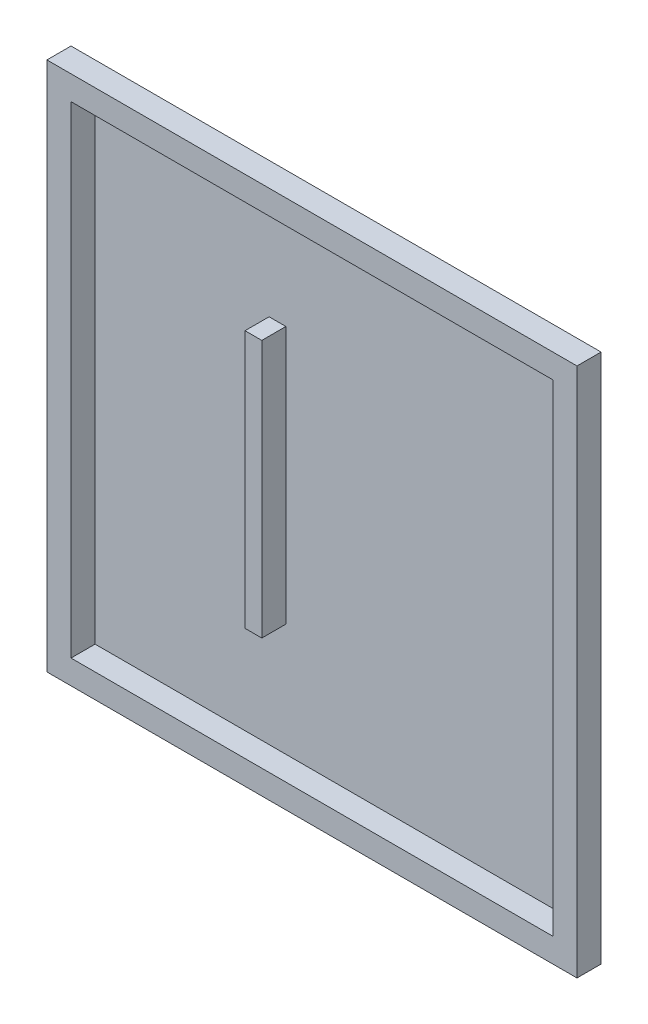
ISO-10303-21;
HEADER;
FILE_DESCRIPTION(('STEP AP214'),'2;1');
FILE_NAME('part.step','',(''),(''),'','','');
FILE_SCHEMA(('AUTOMOTIVE_DESIGN { 1 0 10303 214 1 1 1 1 }'));
ENDSEC;
DATA;
#1=APPLICATION_CONTEXT('core data for automotive mechanical design processes');
#2=APPLICATION_PROTOCOL_DEFINITION('international standard','automotive_design',2000,#1);
#3=PRODUCT_CONTEXT('',#1,'mechanical');
#4=PRODUCT('Part','Part','',(#3));
#5=PRODUCT_RELATED_PRODUCT_CATEGORY('part','',(#4));
#6=PRODUCT_DEFINITION_FORMATION('','',#4);
#7=PRODUCT_DEFINITION_CONTEXT('part definition',#1,'design');
#8=PRODUCT_DEFINITION('design','',#6,#7);
#9=PRODUCT_DEFINITION_SHAPE('','',#8);
#10=(LENGTH_UNIT() NAMED_UNIT(*) SI_UNIT(.MILLI.,.METRE.));
#11=(NAMED_UNIT(*) PLANE_ANGLE_UNIT() SI_UNIT($,.RADIAN.));
#12=(NAMED_UNIT(*) SI_UNIT($,.STERADIAN.) SOLID_ANGLE_UNIT());
#13=UNCERTAINTY_MEASURE_WITH_UNIT(LENGTH_MEASURE(1.E-05),#10,'distance_accuracy_value','');
#14=(GEOMETRIC_REPRESENTATION_CONTEXT(3) GLOBAL_UNCERTAINTY_ASSIGNED_CONTEXT((#13)) GLOBAL_UNIT_ASSIGNED_CONTEXT((#10,
#11,#12)) REPRESENTATION_CONTEXT('',''));
#15=CARTESIAN_POINT('',(0.,0.,0.));
#16=DIRECTION('',(0.,0.,1.));
#17=DIRECTION('',(1.,0.,0.));
#18=AXIS2_PLACEMENT_3D('',#15,#16,#17);
#19=CARTESIAN_POINT('',(0.,0.,1.1));
#20=DIRECTION('',(0.,0.,-1.));
#21=DIRECTION('',(-1.,0.,0.));
#22=AXIS2_PLACEMENT_3D('',#19,#20,#21);
#23=PLANE('',#22);
#24=DIRECTION('',(0.,-1.,0.));
#25=VECTOR('',#24,1.);
#26=CARTESIAN_POINT('',(-22.,0.,1.1));
#27=LINE('',#26,#25);
#28=CARTESIAN_POINT('',(-22.,22.,1.1));
#29=VERTEX_POINT('',#28);
#30=CARTESIAN_POINT('',(-22.,0.,1.1));
#31=VERTEX_POINT('',#30);
#32=EDGE_CURVE('E144',#29,#31,#27,.T.);
#33=ORIENTED_EDGE('',*,*,#32,.T.);
#34=DIRECTION('',(1.,0.,0.));
#35=VECTOR('',#34,1.);
#36=CARTESIAN_POINT('',(-22.,0.,1.1));
#37=LINE('',#36,#35);
#38=CARTESIAN_POINT('',(0.,0.,1.1));
#39=VERTEX_POINT('',#38);
#40=EDGE_CURVE('E147',#31,#39,#37,.T.);
#41=ORIENTED_EDGE('',*,*,#40,.T.);
#42=DIRECTION('',(0.,1.,0.));
#43=VECTOR('',#42,1.);
#44=CARTESIAN_POINT('',(0.,0.,1.1));
#45=LINE('',#44,#43);
#46=CARTESIAN_POINT('',(0.,22.,1.1));
#47=VERTEX_POINT('',#46);
#48=EDGE_CURVE('E150',#39,#47,#45,.T.);
#49=ORIENTED_EDGE('',*,*,#48,.T.);
#50=DIRECTION('',(-1.,0.,0.));
#51=VECTOR('',#50,1.);
#52=CARTESIAN_POINT('',(-22.,22.,1.1));
#53=LINE('',#52,#51);
#54=EDGE_CURVE('E152',#47,#29,#53,.T.);
#55=ORIENTED_EDGE('',*,*,#54,.T.);
#56=EDGE_LOOP('',(#33,#41,#49,#55));
#57=FACE_BOUND('',#56,.T.);
#58=DIRECTION('',(-1.,0.,0.));
#59=VECTOR('',#58,1.);
#60=CARTESIAN_POINT('',(-1.,21.,1.1));
#61=LINE('',#60,#59);
#62=CARTESIAN_POINT('',(-1.,21.,1.1));
#63=VERTEX_POINT('',#62);
#64=CARTESIAN_POINT('',(-21.,21.,1.1));
#65=VERTEX_POINT('',#64);
#66=EDGE_CURVE('E108',#63,#65,#61,.T.);
#67=ORIENTED_EDGE('',*,*,#66,.F.);
#68=DIRECTION('',(0.,1.,0.));
#69=VECTOR('',#68,1.);
#70=CARTESIAN_POINT('',(-0.999999999999997,1.,1.1));
#71=LINE('',#70,#69);
#72=CARTESIAN_POINT('',(-0.999999999999997,1.,1.1));
#73=VERTEX_POINT('',#72);
#74=EDGE_CURVE('E130',#73,#63,#71,.T.);
#75=ORIENTED_EDGE('',*,*,#74,.F.);
#76=DIRECTION('',(1.,0.,0.));
#77=VECTOR('',#76,1.);
#78=CARTESIAN_POINT('',(-21.,1.,1.1));
#79=LINE('',#78,#77);
#80=CARTESIAN_POINT('',(-21.,1.,1.1));
#81=VERTEX_POINT('',#80);
#82=EDGE_CURVE('E128',#81,#73,#79,.T.);
#83=ORIENTED_EDGE('',*,*,#82,.F.);
#84=DIRECTION('',(0.,-1.,0.));
#85=VECTOR('',#84,1.);
#86=CARTESIAN_POINT('',(-21.,21.,1.1));
#87=LINE('',#86,#85);
#88=EDGE_CURVE('E116',#65,#81,#87,.T.);
#89=ORIENTED_EDGE('',*,*,#88,.F.);
#90=EDGE_LOOP('',(#67,#75,#83,#89));
#91=FACE_BOUND('',#90,.T.);
#92=ADVANCED_FACE('F43',(#57,#91),#23,.F.);
#93=CARTESIAN_POINT('',(0.,0.,0.1));
#94=DIRECTION('',(0.,0.,-1.));
#95=DIRECTION('',(-1.,0.,0.));
#96=AXIS2_PLACEMENT_3D('',#93,#94,#95);
#97=PLANE('',#96);
#98=DIRECTION('',(0.,-1.,0.));
#99=VECTOR('',#98,1.);
#100=CARTESIAN_POINT('',(-22.,0.,0.1));
#101=LINE('',#100,#99);
#102=CARTESIAN_POINT('',(-22.,22.,0.1));
#103=VERTEX_POINT('',#102);
#104=CARTESIAN_POINT('',(-22.,0.,0.1));
#105=VERTEX_POINT('',#104);
#106=EDGE_CURVE('E124',#103,#105,#101,.T.);
#107=ORIENTED_EDGE('',*,*,#106,.F.);
#108=DIRECTION('',(-1.,0.,0.));
#109=VECTOR('',#108,1.);
#110=CARTESIAN_POINT('',(-22.,22.,0.1));
#111=LINE('',#110,#109);
#112=CARTESIAN_POINT('',(0.,22.,0.1));
#113=VERTEX_POINT('',#112);
#114=EDGE_CURVE('E148',#113,#103,#111,.T.);
#115=ORIENTED_EDGE('',*,*,#114,.F.);
#116=DIRECTION('',(0.,1.,0.));
#117=VECTOR('',#116,1.);
#118=CARTESIAN_POINT('',(0.,0.,0.1));
#119=LINE('',#118,#117);
#120=CARTESIAN_POINT('',(0.,0.,0.1));
#121=VERTEX_POINT('',#120);
#122=EDGE_CURVE('E159',#121,#113,#119,.T.);
#123=ORIENTED_EDGE('',*,*,#122,.F.);
#124=DIRECTION('',(1.,0.,0.));
#125=VECTOR('',#124,1.);
#126=CARTESIAN_POINT('',(-22.,0.,0.1));
#127=LINE('',#126,#125);
#128=EDGE_CURVE('E157',#105,#121,#127,.T.);
#129=ORIENTED_EDGE('',*,*,#128,.F.);
#130=EDGE_LOOP('',(#107,#115,#123,#129));
#131=FACE_BOUND('',#130,.T.);
#132=DIRECTION('',(0.,1.,0.));
#133=VECTOR('',#132,1.);
#134=CARTESIAN_POINT('',(-0.999999999999997,1.,0.1));
#135=LINE('',#134,#133);
#136=CARTESIAN_POINT('',(-0.999999999999997,1.,0.1));
#137=VERTEX_POINT('',#136);
#138=CARTESIAN_POINT('',(-1.,21.,0.1));
#139=VERTEX_POINT('',#138);
#140=EDGE_CURVE('E117',#137,#139,#135,.T.);
#141=ORIENTED_EDGE('',*,*,#140,.T.);
#142=DIRECTION('',(-1.,0.,0.));
#143=VECTOR('',#142,1.);
#144=CARTESIAN_POINT('',(-1.,21.,0.1));
#145=LINE('',#144,#143);
#146=CARTESIAN_POINT('',(-21.,21.,0.1));
#147=VERTEX_POINT('',#146);
#148=EDGE_CURVE('E66',#139,#147,#145,.T.);
#149=ORIENTED_EDGE('',*,*,#148,.T.);
#150=DIRECTION('',(0.,-1.,0.));
#151=VECTOR('',#150,1.);
#152=CARTESIAN_POINT('',(-21.,21.,0.1));
#153=LINE('',#152,#151);
#154=CARTESIAN_POINT('',(-21.,1.,0.1));
#155=VERTEX_POINT('',#154);
#156=EDGE_CURVE('E123',#147,#155,#153,.T.);
#157=ORIENTED_EDGE('',*,*,#156,.T.);
#158=DIRECTION('',(1.,0.,0.));
#159=VECTOR('',#158,1.);
#160=CARTESIAN_POINT('',(-21.,1.,0.1));
#161=LINE('',#160,#159);
#162=EDGE_CURVE('E136',#155,#137,#161,.T.);
#163=ORIENTED_EDGE('',*,*,#162,.T.);
#164=EDGE_LOOP('',(#141,#149,#157,#163));
#165=FACE_BOUND('',#164,.T.);
#166=ADVANCED_FACE('F177',(#131,#165),#97,.T.);
#167=CARTESIAN_POINT('',(-22.,0.,1.1));
#168=DIRECTION('',(1.,0.,0.));
#169=DIRECTION('',(0.,0.,-1.));
#170=AXIS2_PLACEMENT_3D('',#167,#168,#169);
#171=PLANE('',#170);
#172=ORIENTED_EDGE('',*,*,#106,.T.);
#173=DIRECTION('',(0.,0.,-1.));
#174=VECTOR('',#173,1.);
#175=CARTESIAN_POINT('',(-22.,0.,1.1));
#176=LINE('',#175,#174);
#177=EDGE_CURVE('E12',#31,#105,#176,.T.);
#178=ORIENTED_EDGE('',*,*,#177,.F.);
#179=ORIENTED_EDGE('',*,*,#32,.F.);
#180=DIRECTION('',(0.,0.,-1.));
#181=VECTOR('',#180,1.);
#182=CARTESIAN_POINT('',(-22.,22.,1.1));
#183=LINE('',#182,#181);
#184=EDGE_CURVE('E154',#29,#103,#183,.T.);
#185=ORIENTED_EDGE('',*,*,#184,.T.);
#186=EDGE_LOOP('',(#172,#178,#179,#185));
#187=FACE_BOUND('',#186,.T.);
#188=ADVANCED_FACE('F45',(#187),#171,.F.);
#189=CARTESIAN_POINT('',(-22.,0.,1.1));
#190=DIRECTION('',(0.,1.,0.));
#191=DIRECTION('',(0.,0.,1.));
#192=AXIS2_PLACEMENT_3D('',#189,#190,#191);
#193=PLANE('',#192);
#194=ORIENTED_EDGE('',*,*,#128,.T.);
#195=DIRECTION('',(0.,0.,-1.));
#196=VECTOR('',#195,1.);
#197=CARTESIAN_POINT('',(0.,0.,1.1));
#198=LINE('',#197,#196);
#199=EDGE_CURVE('E51',#39,#121,#198,.T.);
#200=ORIENTED_EDGE('',*,*,#199,.F.);
#201=ORIENTED_EDGE('',*,*,#40,.F.);
#202=ORIENTED_EDGE('',*,*,#177,.T.);
#203=EDGE_LOOP('',(#194,#200,#201,#202));
#204=FACE_BOUND('',#203,.T.);
#205=ADVANCED_FACE('F187',(#204),#193,.F.);
#206=CARTESIAN_POINT('',(0.,0.,1.1));
#207=DIRECTION('',(-1.,0.,0.));
#208=DIRECTION('',(0.,0.,1.));
#209=AXIS2_PLACEMENT_3D('',#206,#207,#208);
#210=PLANE('',#209);
#211=ORIENTED_EDGE('',*,*,#122,.T.);
#212=DIRECTION('',(0.,0.,-1.));
#213=VECTOR('',#212,1.);
#214=CARTESIAN_POINT('',(0.,22.,1.1));
#215=LINE('',#214,#213);
#216=EDGE_CURVE('E164',#47,#113,#215,.T.);
#217=ORIENTED_EDGE('',*,*,#216,.F.);
#218=ORIENTED_EDGE('',*,*,#48,.F.);
#219=ORIENTED_EDGE('',*,*,#199,.T.);
#220=EDGE_LOOP('',(#211,#217,#218,#219));
#221=FACE_BOUND('',#220,.T.);
#222=ADVANCED_FACE('F171',(#221),#210,.F.);
#223=CARTESIAN_POINT('',(-22.,22.,1.1));
#224=DIRECTION('',(0.,-1.,0.));
#225=DIRECTION('',(1.,0.,0.));
#226=AXIS2_PLACEMENT_3D('',#223,#224,#225);
#227=PLANE('',#226);
#228=ORIENTED_EDGE('',*,*,#114,.T.);
#229=ORIENTED_EDGE('',*,*,#184,.F.);
#230=ORIENTED_EDGE('',*,*,#54,.F.);
#231=ORIENTED_EDGE('',*,*,#216,.T.);
#232=EDGE_LOOP('',(#228,#229,#230,#231));
#233=FACE_BOUND('',#232,.T.);
#234=ADVANCED_FACE('F181',(#233),#227,.F.);
#235=CARTESIAN_POINT('',(-1.,21.,1.1));
#236=DIRECTION('',(0.,-1.,0.));
#237=DIRECTION('',(0.,0.,-1.));
#238=AXIS2_PLACEMENT_3D('',#235,#236,#237);
#239=PLANE('',#238);
#240=ORIENTED_EDGE('',*,*,#148,.F.);
#241=DIRECTION('',(0.,0.,-1.));
#242=VECTOR('',#241,1.);
#243=CARTESIAN_POINT('',(-1.,21.,1.1));
#244=LINE('',#243,#242);
#245=EDGE_CURVE('E112',#63,#139,#244,.T.);
#246=ORIENTED_EDGE('',*,*,#245,.F.);
#247=ORIENTED_EDGE('',*,*,#66,.T.);
#248=DIRECTION('',(0.,0.,-1.));
#249=VECTOR('',#248,1.);
#250=CARTESIAN_POINT('',(-21.,21.,1.1));
#251=LINE('',#250,#249);
#252=EDGE_CURVE('E111',#65,#147,#251,.T.);
#253=ORIENTED_EDGE('',*,*,#252,.T.);
#254=EDGE_LOOP('',(#240,#246,#247,#253));
#255=FACE_BOUND('',#254,.T.);
#256=ADVANCED_FACE('F110',(#255),#239,.T.);
#257=CARTESIAN_POINT('',(-21.,21.,1.1));
#258=DIRECTION('',(1.,0.,0.));
#259=DIRECTION('',(0.,1.,0.));
#260=AXIS2_PLACEMENT_3D('',#257,#258,#259);
#261=PLANE('',#260);
#262=ORIENTED_EDGE('',*,*,#156,.F.);
#263=ORIENTED_EDGE('',*,*,#252,.F.);
#264=ORIENTED_EDGE('',*,*,#88,.T.);
#265=DIRECTION('',(0.,0.,-1.));
#266=VECTOR('',#265,1.);
#267=CARTESIAN_POINT('',(-21.,1.,1.1));
#268=LINE('',#267,#266);
#269=EDGE_CURVE('E125',#81,#155,#268,.T.);
#270=ORIENTED_EDGE('',*,*,#269,.T.);
#271=EDGE_LOOP('',(#262,#263,#264,#270));
#272=FACE_BOUND('',#271,.T.);
#273=ADVANCED_FACE('F120',(#272),#261,.T.);
#274=CARTESIAN_POINT('',(-21.,1.,1.1));
#275=DIRECTION('',(0.,1.,0.));
#276=DIRECTION('',(0.,0.,1.));
#277=AXIS2_PLACEMENT_3D('',#274,#275,#276);
#278=PLANE('',#277);
#279=ORIENTED_EDGE('',*,*,#162,.F.);
#280=ORIENTED_EDGE('',*,*,#269,.F.);
#281=ORIENTED_EDGE('',*,*,#82,.T.);
#282=DIRECTION('',(0.,0.,-1.));
#283=VECTOR('',#282,1.);
#284=CARTESIAN_POINT('',(-0.999999999999997,1.,1.1));
#285=LINE('',#284,#283);
#286=EDGE_CURVE('E58',#73,#137,#285,.T.);
#287=ORIENTED_EDGE('',*,*,#286,.T.);
#288=EDGE_LOOP('',(#279,#280,#281,#287));
#289=FACE_BOUND('',#288,.T.);
#290=ADVANCED_FACE('F210',(#289),#278,.T.);
#291=CARTESIAN_POINT('',(-0.999999999999997,1.,1.1));
#292=DIRECTION('',(-1.,0.,0.));
#293=DIRECTION('',(0.,-1.,0.));
#294=AXIS2_PLACEMENT_3D('',#291,#292,#293);
#295=PLANE('',#294);
#296=ORIENTED_EDGE('',*,*,#140,.F.);
#297=ORIENTED_EDGE('',*,*,#286,.F.);
#298=ORIENTED_EDGE('',*,*,#74,.T.);
#299=ORIENTED_EDGE('',*,*,#245,.T.);
#300=EDGE_LOOP('',(#296,#297,#298,#299));
#301=FACE_BOUND('',#300,.T.);
#302=ADVANCED_FACE('F214',(#301),#295,.T.);
#303=CLOSED_SHELL('',(#92,#166,#188,#205,#222,#234,#256,#273,#290,#302));
#304=MANIFOLD_SOLID_BREP('B2',#303);
#305=CARTESIAN_POINT('',(0.,0.,0.1));
#306=DIRECTION('',(0.,0.,1.));
#307=DIRECTION('',(1.,0.,0.));
#308=AXIS2_PLACEMENT_3D('',#305,#306,#307);
#309=PLANE('',#308);
#310=DIRECTION('',(0.,-1.,0.));
#311=VECTOR('',#310,1.);
#312=CARTESIAN_POINT('',(-21.,21.,0.1));
#313=LINE('',#312,#311);
#314=CARTESIAN_POINT('',(-21.,21.,0.1));
#315=VERTEX_POINT('',#314);
#316=CARTESIAN_POINT('',(-21.,1.,0.1));
#317=VERTEX_POINT('',#316);
#318=EDGE_CURVE('E380',#315,#317,#313,.T.);
#319=ORIENTED_EDGE('',*,*,#318,.T.);
#320=DIRECTION('',(1.,0.,0.));
#321=VECTOR('',#320,1.);
#322=CARTESIAN_POINT('',(-21.,1.,0.1));
#323=LINE('',#322,#321);
#324=CARTESIAN_POINT('',(-0.999999999999997,1.,0.1));
#325=VERTEX_POINT('',#324);
#326=EDGE_CURVE('E325',#317,#325,#323,.T.);
#327=ORIENTED_EDGE('',*,*,#326,.T.);
#328=DIRECTION('',(0.,1.,0.));
#329=VECTOR('',#328,1.);
#330=CARTESIAN_POINT('',(-1.,21.,0.1));
#331=LINE('',#330,#329);
#332=CARTESIAN_POINT('',(-1.,21.,0.1));
#333=VERTEX_POINT('',#332);
#334=EDGE_CURVE('E383',#325,#333,#331,.T.);
#335=ORIENTED_EDGE('',*,*,#334,.T.);
#336=DIRECTION('',(-1.,0.,0.));
#337=VECTOR('',#336,1.);
#338=CARTESIAN_POINT('',(-21.,21.,0.1));
#339=LINE('',#338,#337);
#340=EDGE_CURVE('E297',#333,#315,#339,.T.);
#341=ORIENTED_EDGE('',*,*,#340,.T.);
#342=EDGE_LOOP('',(#319,#327,#335,#341));
#343=FACE_BOUND('',#342,.T.);
#344=DIRECTION('',(1.,0.,0.));
#345=VECTOR('',#344,1.);
#346=CARTESIAN_POINT('',(-13.7785698415186,5.67865001789557,0.1));
#347=LINE('',#346,#345);
#348=CARTESIAN_POINT('',(-13.7785698415186,5.67865001789557,0.1));
#349=VERTEX_POINT('',#348);
#350=CARTESIAN_POINT('',(-13.0818611654021,5.67865001789557,0.1));
#351=VERTEX_POINT('',#350);
#352=EDGE_CURVE('E503',#349,#351,#347,.T.);
#353=ORIENTED_EDGE('',*,*,#352,.F.);
#354=DIRECTION('',(0.,-1.,0.));
#355=VECTOR('',#354,1.);
#356=CARTESIAN_POINT('',(-13.7785698415186,5.67865001789557,0.1));
#357=LINE('',#356,#355);
#358=CARTESIAN_POINT('',(-13.7785698415186,16.3776821386762,0.1));
#359=VERTEX_POINT('',#358);
#360=EDGE_CURVE('E370',#359,#349,#357,.T.);
#361=ORIENTED_EDGE('',*,*,#360,.F.);
#362=DIRECTION('',(-1.,0.,0.));
#363=VECTOR('',#362,1.);
#364=CARTESIAN_POINT('',(-13.7785698415186,16.3776821386762,0.1));
#365=LINE('',#364,#363);
#366=CARTESIAN_POINT('',(-13.0818611654021,16.3776821386762,0.1));
#367=VERTEX_POINT('',#366);
#368=EDGE_CURVE('E366',#367,#359,#365,.T.);
#369=ORIENTED_EDGE('',*,*,#368,.F.);
#370=DIRECTION('',(0.,1.,0.));
#371=VECTOR('',#370,1.);
#372=CARTESIAN_POINT('',(-13.0818611654021,5.67865001789557,0.1));
#373=LINE('',#372,#371);
#374=EDGE_CURVE('E500',#351,#367,#373,.T.);
#375=ORIENTED_EDGE('',*,*,#374,.F.);
#376=EDGE_LOOP('',(#353,#361,#369,#375));
#377=FACE_BOUND('',#376,.T.);
#378=ADVANCED_FACE('F273',(#343,#377),#309,.T.);
#379=CARTESIAN_POINT('',(-21.,21.,0.1));
#380=DIRECTION('',(1.,0.,0.));
#381=DIRECTION('',(0.,1.,0.));
#382=AXIS2_PLACEMENT_3D('',#379,#380,#381);
#383=PLANE('',#382);
#384=DIRECTION('',(0.,-1.,0.));
#385=VECTOR('',#384,1.);
#386=CARTESIAN_POINT('',(-21.,21.,0.));
#387=LINE('',#386,#385);
#388=CARTESIAN_POINT('',(-21.,21.,0.));
#389=VERTEX_POINT('',#388);
#390=CARTESIAN_POINT('',(-21.,1.,0.));
#391=VERTEX_POINT('',#390);
#392=EDGE_CURVE('E372',#389,#391,#387,.T.);
#393=ORIENTED_EDGE('',*,*,#392,.T.);
#394=DIRECTION('',(0.,0.,-1.));
#395=VECTOR('',#394,1.);
#396=CARTESIAN_POINT('',(-21.,1.,0.1));
#397=LINE('',#396,#395);
#398=EDGE_CURVE('E41',#317,#391,#397,.T.);
#399=ORIENTED_EDGE('',*,*,#398,.F.);
#400=ORIENTED_EDGE('',*,*,#318,.F.);
#401=DIRECTION('',(0.,0.,-1.));
#402=VECTOR('',#401,1.);
#403=CARTESIAN_POINT('',(-21.,21.,0.1));
#404=LINE('',#403,#402);
#405=EDGE_CURVE('E385',#315,#389,#404,.T.);
#406=ORIENTED_EDGE('',*,*,#405,.T.);
#407=EDGE_LOOP('',(#393,#399,#400,#406));
#408=FACE_BOUND('',#407,.T.);
#409=ADVANCED_FACE('F275',(#408),#383,.F.);
#410=CARTESIAN_POINT('',(-21.,1.,0.1));
#411=DIRECTION('',(0.,1.,0.));
#412=DIRECTION('',(0.,0.,1.));
#413=AXIS2_PLACEMENT_3D('',#410,#411,#412);
#414=PLANE('',#413);
#415=DIRECTION('',(1.,0.,0.));
#416=VECTOR('',#415,1.);
#417=CARTESIAN_POINT('',(-21.,1.,0.));
#418=LINE('',#417,#416);
#419=CARTESIAN_POINT('',(-0.999999999999997,1.,0.));
#420=VERTEX_POINT('',#419);
#421=EDGE_CURVE('E375',#391,#420,#418,.T.);
#422=ORIENTED_EDGE('',*,*,#421,.T.);
#423=DIRECTION('',(0.,0.,-1.));
#424=VECTOR('',#423,1.);
#425=CARTESIAN_POINT('',(-0.999999999999997,1.,0.1));
#426=LINE('',#425,#424);
#427=EDGE_CURVE('E281',#325,#420,#426,.T.);
#428=ORIENTED_EDGE('',*,*,#427,.F.);
#429=ORIENTED_EDGE('',*,*,#326,.F.);
#430=ORIENTED_EDGE('',*,*,#398,.T.);
#431=EDGE_LOOP('',(#422,#428,#429,#430));
#432=FACE_BOUND('',#431,.T.);
#433=ADVANCED_FACE('F413',(#432),#414,.F.);
#434=CARTESIAN_POINT('',(-1.,21.,0.1));
#435=DIRECTION('',(-1.,0.,0.));
#436=DIRECTION('',(0.,-1.,0.));
#437=AXIS2_PLACEMENT_3D('',#434,#435,#436);
#438=PLANE('',#437);
#439=DIRECTION('',(0.,1.,0.));
#440=VECTOR('',#439,1.);
#441=CARTESIAN_POINT('',(-1.,21.,0.));
#442=LINE('',#441,#440);
#443=CARTESIAN_POINT('',(-1.,21.,0.));
#444=VERTEX_POINT('',#443);
#445=EDGE_CURVE('E388',#420,#444,#442,.T.);
#446=ORIENTED_EDGE('',*,*,#445,.T.);
#447=DIRECTION('',(0.,0.,-1.));
#448=VECTOR('',#447,1.);
#449=CARTESIAN_POINT('',(-1.,21.,0.1));
#450=LINE('',#449,#448);
#451=EDGE_CURVE('E392',#333,#444,#450,.T.);
#452=ORIENTED_EDGE('',*,*,#451,.F.);
#453=ORIENTED_EDGE('',*,*,#334,.F.);
#454=ORIENTED_EDGE('',*,*,#427,.T.);
#455=EDGE_LOOP('',(#446,#452,#453,#454));
#456=FACE_BOUND('',#455,.T.);
#457=ADVANCED_FACE('F397',(#456),#438,.F.);
#458=CARTESIAN_POINT('',(-21.,21.,0.1));
#459=DIRECTION('',(0.,-1.,0.));
#460=DIRECTION('',(0.,0.,-1.));
#461=AXIS2_PLACEMENT_3D('',#458,#459,#460);
#462=PLANE('',#461);
#463=DIRECTION('',(-1.,0.,0.));
#464=VECTOR('',#463,1.);
#465=CARTESIAN_POINT('',(-21.,21.,0.));
#466=LINE('',#465,#464);
#467=EDGE_CURVE('E318',#444,#389,#466,.T.);
#468=ORIENTED_EDGE('',*,*,#467,.T.);
#469=ORIENTED_EDGE('',*,*,#405,.F.);
#470=ORIENTED_EDGE('',*,*,#340,.F.);
#471=ORIENTED_EDGE('',*,*,#451,.T.);
#472=EDGE_LOOP('',(#468,#469,#470,#471));
#473=FACE_BOUND('',#472,.T.);
#474=ADVANCED_FACE('F405',(#473),#462,.F.);
#475=CARTESIAN_POINT('',(0.,0.,0.));
#476=DIRECTION('',(0.,0.,1.));
#477=DIRECTION('',(1.,0.,0.));
#478=AXIS2_PLACEMENT_3D('',#475,#476,#477);
#479=PLANE('',#478);
#480=ORIENTED_EDGE('',*,*,#392,.F.);
#481=ORIENTED_EDGE('',*,*,#467,.F.);
#482=ORIENTED_EDGE('',*,*,#445,.F.);
#483=ORIENTED_EDGE('',*,*,#421,.F.);
#484=EDGE_LOOP('',(#480,#481,#482,#483));
#485=FACE_BOUND('',#484,.T.);
#486=ADVANCED_FACE('F401',(#485),#479,.F.);
#487=CARTESIAN_POINT('',(-13.7785698415186,5.67865001789557,1.1));
#488=DIRECTION('',(1.,0.,0.));
#489=DIRECTION('',(0.,0.,-1.));
#490=AXIS2_PLACEMENT_3D('',#487,#488,#489);
#491=PLANE('',#490);
#492=ORIENTED_EDGE('',*,*,#360,.T.);
#493=DIRECTION('',(0.,0.,-1.));
#494=VECTOR('',#493,1.);
#495=CARTESIAN_POINT('',(-13.7785698415186,5.67865001789557,1.1));
#496=LINE('',#495,#494);
#497=CARTESIAN_POINT('',(-13.7785698415186,5.67865001789557,1.1));
#498=VERTEX_POINT('',#497);
#499=EDGE_CURVE('E351',#498,#349,#496,.T.);
#500=ORIENTED_EDGE('',*,*,#499,.F.);
#501=DIRECTION('',(0.,-1.,0.));
#502=VECTOR('',#501,1.);
#503=CARTESIAN_POINT('',(-13.7785698415186,5.67865001789557,1.1));
#504=LINE('',#503,#502);
#505=CARTESIAN_POINT('',(-13.7785698415186,16.3776821386762,1.1));
#506=VERTEX_POINT('',#505);
#507=EDGE_CURVE('E358',#506,#498,#504,.T.);
#508=ORIENTED_EDGE('',*,*,#507,.F.);
#509=DIRECTION('',(0.,0.,-1.));
#510=VECTOR('',#509,1.);
#511=CARTESIAN_POINT('',(-13.7785698415186,16.3776821386762,1.1));
#512=LINE('',#511,#510);
#513=EDGE_CURVE('E498',#506,#359,#512,.T.);
#514=ORIENTED_EDGE('',*,*,#513,.T.);
#515=EDGE_LOOP('',(#492,#500,#508,#514));
#516=FACE_BOUND('',#515,.T.);
#517=ADVANCED_FACE('F368',(#516),#491,.F.);
#518=CARTESIAN_POINT('',(-13.7785698415186,5.67865001789557,1.1));
#519=DIRECTION('',(0.,1.,0.));
#520=DIRECTION('',(0.,0.,1.));
#521=AXIS2_PLACEMENT_3D('',#518,#519,#520);
#522=PLANE('',#521);
#523=ORIENTED_EDGE('',*,*,#352,.T.);
#524=DIRECTION('',(0.,0.,-1.));
#525=VECTOR('',#524,1.);
#526=CARTESIAN_POINT('',(-13.0818611654021,5.67865001789557,1.1));
#527=LINE('',#526,#525);
#528=CARTESIAN_POINT('',(-13.0818611654021,5.67865001789557,1.1));
#529=VERTEX_POINT('',#528);
#530=EDGE_CURVE('E354',#529,#351,#527,.T.);
#531=ORIENTED_EDGE('',*,*,#530,.F.);
#532=DIRECTION('',(1.,0.,0.));
#533=VECTOR('',#532,1.);
#534=CARTESIAN_POINT('',(-13.7785698415186,5.67865001789557,1.1));
#535=LINE('',#534,#533);
#536=EDGE_CURVE('E347',#498,#529,#535,.T.);
#537=ORIENTED_EDGE('',*,*,#536,.F.);
#538=ORIENTED_EDGE('',*,*,#499,.T.);
#539=EDGE_LOOP('',(#523,#531,#537,#538));
#540=FACE_BOUND('',#539,.T.);
#541=ADVANCED_FACE('F349',(#540),#522,.F.);
#542=CARTESIAN_POINT('',(-13.0818611654021,5.67865001789557,1.1));
#543=DIRECTION('',(-1.,0.,0.));
#544=DIRECTION('',(0.,0.,1.));
#545=AXIS2_PLACEMENT_3D('',#542,#543,#544);
#546=PLANE('',#545);
#547=ORIENTED_EDGE('',*,*,#374,.T.);
#548=DIRECTION('',(0.,0.,-1.));
#549=VECTOR('',#548,1.);
#550=CARTESIAN_POINT('',(-13.0818611654021,16.3776821386762,1.1));
#551=LINE('',#550,#549);
#552=CARTESIAN_POINT('',(-13.0818611654021,16.3776821386762,1.1));
#553=VERTEX_POINT('',#552);
#554=EDGE_CURVE('E288',#553,#367,#551,.T.);
#555=ORIENTED_EDGE('',*,*,#554,.F.);
#556=DIRECTION('',(0.,1.,0.));
#557=VECTOR('',#556,1.);
#558=CARTESIAN_POINT('',(-13.0818611654021,5.67865001789557,1.1));
#559=LINE('',#558,#557);
#560=EDGE_CURVE('E357',#529,#553,#559,.T.);
#561=ORIENTED_EDGE('',*,*,#560,.F.);
#562=ORIENTED_EDGE('',*,*,#530,.T.);
#563=EDGE_LOOP('',(#547,#555,#561,#562));
#564=FACE_BOUND('',#563,.T.);
#565=ADVANCED_FACE('F426',(#564),#546,.F.);
#566=CARTESIAN_POINT('',(-13.7785698415186,16.3776821386762,1.1));
#567=DIRECTION('',(0.,-1.,0.));
#568=DIRECTION('',(0.,0.,-1.));
#569=AXIS2_PLACEMENT_3D('',#566,#567,#568);
#570=PLANE('',#569);
#571=ORIENTED_EDGE('',*,*,#368,.T.);
#572=ORIENTED_EDGE('',*,*,#513,.F.);
#573=DIRECTION('',(-1.,0.,0.));
#574=VECTOR('',#573,1.);
#575=CARTESIAN_POINT('',(-13.7785698415186,16.3776821386762,1.1));
#576=LINE('',#575,#574);
#577=EDGE_CURVE('E362',#553,#506,#576,.T.);
#578=ORIENTED_EDGE('',*,*,#577,.F.);
#579=ORIENTED_EDGE('',*,*,#554,.T.);
#580=EDGE_LOOP('',(#571,#572,#578,#579));
#581=FACE_BOUND('',#580,.T.);
#582=ADVANCED_FACE('F429',(#581),#570,.F.);
#583=CARTESIAN_POINT('',(0.,0.,1.1));
#584=DIRECTION('',(0.,0.,-1.));
#585=DIRECTION('',(-1.,0.,0.));
#586=AXIS2_PLACEMENT_3D('',#583,#584,#585);
#587=PLANE('',#586);
#588=ORIENTED_EDGE('',*,*,#507,.T.);
#589=ORIENTED_EDGE('',*,*,#536,.T.);
#590=ORIENTED_EDGE('',*,*,#560,.T.);
#591=ORIENTED_EDGE('',*,*,#577,.T.);
#592=EDGE_LOOP('',(#588,#589,#590,#591));
#593=FACE_BOUND('',#592,.T.);
#594=ADVANCED_FACE('F361',(#593),#587,.F.);
#595=CLOSED_SHELL('',(#378,#409,#433,#457,#474,#486,#517,#541,#565,#582,#594));
#596=MANIFOLD_SOLID_BREP('B6',#595);
#597=ADVANCED_BREP_SHAPE_REPRESENTATION('',(#18,#304,#596),#14);
#598=SHAPE_DEFINITION_REPRESENTATION(#9,#597);
ENDSEC;
END-ISO-10303-21;
